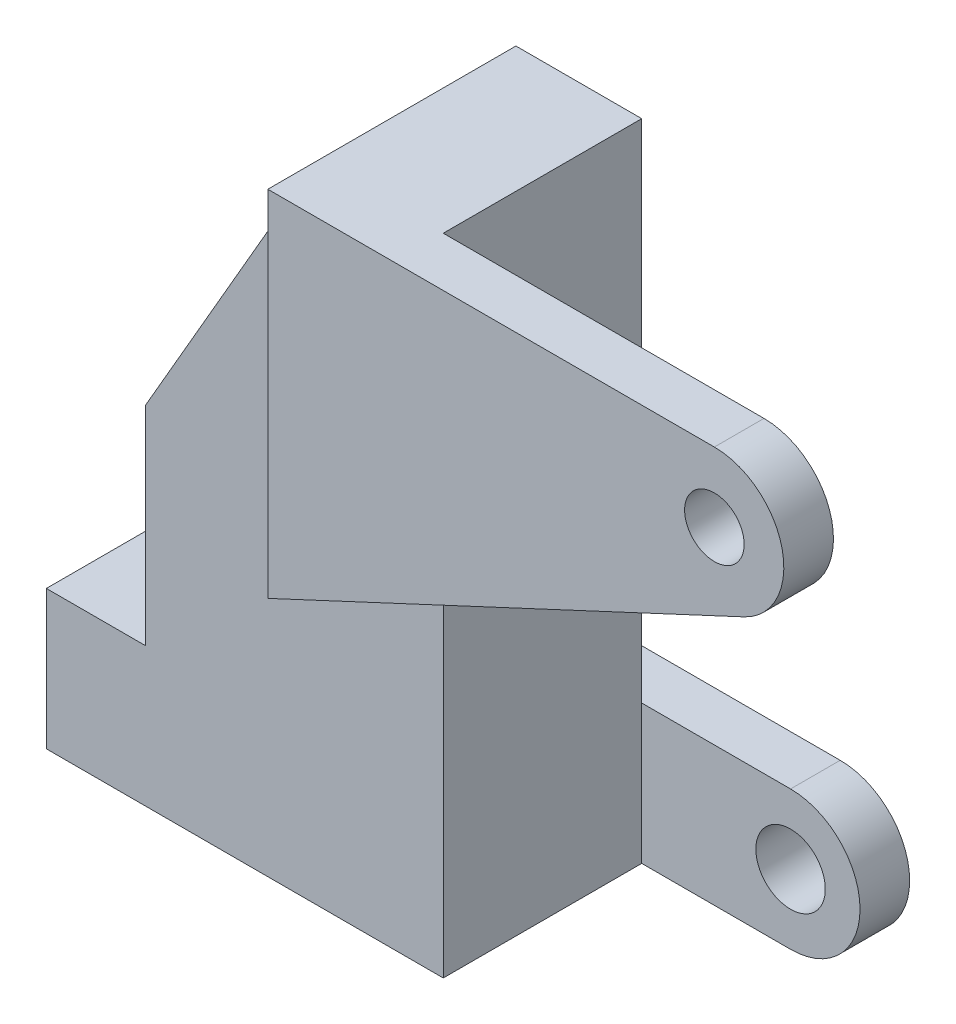
ISO-10303-21;
HEADER;
FILE_DESCRIPTION(('STEP AP214'),'2;1');
FILE_NAME('part.step','',(''),(''),'','','');
FILE_SCHEMA(('AUTOMOTIVE_DESIGN { 1 0 10303 214 1 1 1 1 }'));
ENDSEC;
DATA;
#1=APPLICATION_CONTEXT('core data for automotive mechanical design processes');
#2=APPLICATION_PROTOCOL_DEFINITION('international standard','automotive_design',2000,#1);
#3=PRODUCT_CONTEXT('',#1,'mechanical');
#4=PRODUCT('Part','Part','',(#3));
#5=PRODUCT_RELATED_PRODUCT_CATEGORY('part','',(#4));
#6=PRODUCT_DEFINITION_FORMATION('','',#4);
#7=PRODUCT_DEFINITION_CONTEXT('part definition',#1,'design');
#8=PRODUCT_DEFINITION('design','',#6,#7);
#9=PRODUCT_DEFINITION_SHAPE('','',#8);
#10=(LENGTH_UNIT() NAMED_UNIT(*) SI_UNIT(.MILLI.,.METRE.));
#11=(NAMED_UNIT(*) PLANE_ANGLE_UNIT() SI_UNIT($,.RADIAN.));
#12=(NAMED_UNIT(*) SI_UNIT($,.STERADIAN.) SOLID_ANGLE_UNIT());
#13=UNCERTAINTY_MEASURE_WITH_UNIT(LENGTH_MEASURE(1.E-05),#10,'distance_accuracy_value','');
#14=(GEOMETRIC_REPRESENTATION_CONTEXT(3) GLOBAL_UNCERTAINTY_ASSIGNED_CONTEXT((#13)) GLOBAL_UNIT_ASSIGNED_CONTEXT((#10,
#11,#12)) REPRESENTATION_CONTEXT('',''));
#15=CARTESIAN_POINT('',(0.,0.,0.));
#16=DIRECTION('',(0.,0.,1.));
#17=DIRECTION('',(1.,0.,0.));
#18=AXIS2_PLACEMENT_3D('',#15,#16,#17);
#19=CARTESIAN_POINT('',(0.,0.,0.));
#20=DIRECTION('',(0.,0.,1.));
#21=DIRECTION('',(1.,0.,0.));
#22=AXIS2_PLACEMENT_3D('',#19,#20,#21);
#23=PLANE('',#22);
#24=DIRECTION('',(0.,1.,0.));
#25=VECTOR('',#24,1.);
#26=CARTESIAN_POINT('',(10.,14.,0.));
#27=LINE('',#26,#25);
#28=CARTESIAN_POINT('',(10.,0.,0.));
#29=VERTEX_POINT('',#28);
#30=CARTESIAN_POINT('',(10.,14.,0.));
#31=VERTEX_POINT('',#30);
#32=EDGE_CURVE('E61',#29,#31,#27,.T.);
#33=ORIENTED_EDGE('',*,*,#32,.F.);
#34=DIRECTION('',(1.,0.,0.));
#35=VECTOR('',#34,1.);
#36=CARTESIAN_POINT('',(0.,0.,0.));
#37=LINE('',#36,#35);
#38=CARTESIAN_POINT('',(0.,0.,0.));
#39=VERTEX_POINT('',#38);
#40=EDGE_CURVE('E266',#39,#29,#37,.T.);
#41=ORIENTED_EDGE('',*,*,#40,.F.);
#42=DIRECTION('',(0.,-1.,0.));
#43=VECTOR('',#42,1.);
#44=CARTESIAN_POINT('',(0.,14.,0.));
#45=LINE('',#44,#43);
#46=CARTESIAN_POINT('',(0.,14.,0.));
#47=VERTEX_POINT('',#46);
#48=EDGE_CURVE('E241',#47,#39,#45,.T.);
#49=ORIENTED_EDGE('',*,*,#48,.F.);
#50=DIRECTION('',(-1.,0.,0.));
#51=VECTOR('',#50,1.);
#52=CARTESIAN_POINT('',(10.,14.,0.));
#53=LINE('',#52,#51);
#54=EDGE_CURVE('E247',#31,#47,#53,.T.);
#55=ORIENTED_EDGE('',*,*,#54,.F.);
#56=EDGE_LOOP('',(#33,#41,#49,#55));
#57=FACE_BOUND('',#56,.T.);
#58=ADVANCED_FACE('F45',(#57),#23,.F.);
#59=DIRECTION('',(1.,0.,0.));
#60=VECTOR('',#59,1.);
#61=CARTESIAN_POINT('',(10.,14.,0.));
#62=LINE('',#61,#60);
#63=CARTESIAN_POINT('',(40.,14.,0.));
#64=VERTEX_POINT('',#63);
#65=EDGE_CURVE('E324',#31,#64,#62,.T.);
#66=ORIENTED_EDGE('',*,*,#65,.F.);
#67=DIRECTION('',(0.,-1.,0.));
#68=VECTOR('',#67,1.);
#69=CARTESIAN_POINT('',(10.,35.,0.));
#70=LINE('',#69,#68);
#71=CARTESIAN_POINT('',(10.,35.,0.));
#72=VERTEX_POINT('',#71);
#73=EDGE_CURVE('E279',#72,#31,#70,.T.);
#74=ORIENTED_EDGE('',*,*,#73,.F.);
#75=DIRECTION('',(-0.500000000000001,-0.866025403784438,0.));
#76=VECTOR('',#75,1.);
#77=CARTESIAN_POINT('',(27.3205080756888,65.,0.));
#78=LINE('',#77,#76);
#79=CARTESIAN_POINT('',(27.3205080756888,65.,0.));
#80=VERTEX_POINT('',#79);
#81=EDGE_CURVE('E276',#80,#72,#78,.T.);
#82=ORIENTED_EDGE('',*,*,#81,.F.);
#83=DIRECTION('',(-1.,0.,0.));
#84=VECTOR('',#83,1.);
#85=CARTESIAN_POINT('',(40.,65.,0.));
#86=LINE('',#85,#84);
#87=CARTESIAN_POINT('',(40.,65.,0.));
#88=VERTEX_POINT('',#87);
#89=EDGE_CURVE('E273',#88,#80,#86,.T.);
#90=ORIENTED_EDGE('',*,*,#89,.F.);
#91=DIRECTION('',(0.,1.,0.));
#92=VECTOR('',#91,1.);
#93=CARTESIAN_POINT('',(40.,0.,0.));
#94=LINE('',#93,#92);
#95=EDGE_CURVE('E269',#64,#88,#94,.T.);
#96=ORIENTED_EDGE('',*,*,#95,.F.);
#97=EDGE_LOOP('',(#66,#74,#82,#90,#96));
#98=FACE_BOUND('',#97,.T.);
#99=ADVANCED_FACE('F358',(#98),#23,.F.);
#100=CARTESIAN_POINT('',(0.,14.,20.));
#101=DIRECTION('',(1.,0.,0.));
#102=DIRECTION('',(0.,0.,-1.));
#103=AXIS2_PLACEMENT_3D('',#100,#101,#102);
#104=PLANE('',#103);
#105=ORIENTED_EDGE('',*,*,#48,.T.);
#106=DIRECTION('',(0.,0.,-1.));
#107=VECTOR('',#106,1.);
#108=CARTESIAN_POINT('',(0.,0.,20.));
#109=LINE('',#108,#107);
#110=CARTESIAN_POINT('',(0.,0.,20.));
#111=VERTEX_POINT('',#110);
#112=EDGE_CURVE('E11',#111,#39,#109,.T.);
#113=ORIENTED_EDGE('',*,*,#112,.F.);
#114=DIRECTION('',(0.,-1.,0.));
#115=VECTOR('',#114,1.);
#116=CARTESIAN_POINT('',(0.,14.,20.));
#117=LINE('',#116,#115);
#118=CARTESIAN_POINT('',(0.,14.,20.));
#119=VERTEX_POINT('',#118);
#120=EDGE_CURVE('E242',#119,#111,#117,.T.);
#121=ORIENTED_EDGE('',*,*,#120,.F.);
#122=DIRECTION('',(0.,0.,-1.));
#123=VECTOR('',#122,1.);
#124=CARTESIAN_POINT('',(0.,14.,20.));
#125=LINE('',#124,#123);
#126=EDGE_CURVE('E262',#119,#47,#125,.T.);
#127=ORIENTED_EDGE('',*,*,#126,.T.);
#128=EDGE_LOOP('',(#105,#113,#121,#127));
#129=FACE_BOUND('',#128,.T.);
#130=ADVANCED_FACE('F47',(#129),#104,.F.);
#131=CARTESIAN_POINT('',(0.,0.,20.));
#132=DIRECTION('',(0.,1.,0.));
#133=DIRECTION('',(0.,0.,1.));
#134=AXIS2_PLACEMENT_3D('',#131,#132,#133);
#135=PLANE('',#134);
#136=ORIENTED_EDGE('',*,*,#40,.T.);
#137=DIRECTION('',(0.,0.,1.));
#138=VECTOR('',#137,1.);
#139=CARTESIAN_POINT('',(10.,0.,-5.));
#140=LINE('',#139,#138);
#141=CARTESIAN_POINT('',(10.,0.,-5.));
#142=VERTEX_POINT('',#141);
#143=EDGE_CURVE('E328',#142,#29,#140,.T.);
#144=ORIENTED_EDGE('',*,*,#143,.F.);
#145=DIRECTION('',(-1.,0.,0.));
#146=VECTOR('',#145,1.);
#147=CARTESIAN_POINT('',(10.,0.,-5.));
#148=LINE('',#147,#146);
#149=CARTESIAN_POINT('',(55.,0.,-5.));
#150=VERTEX_POINT('',#149);
#151=EDGE_CURVE('E173',#150,#142,#148,.T.);
#152=ORIENTED_EDGE('',*,*,#151,.F.);
#153=DIRECTION('',(0.,0.,1.));
#154=VECTOR('',#153,1.);
#155=CARTESIAN_POINT('',(55.,0.,-5.));
#156=LINE('',#155,#154);
#157=CARTESIAN_POINT('',(55.,0.,0.));
#158=VERTEX_POINT('',#157);
#159=EDGE_CURVE('E189',#150,#158,#156,.T.);
#160=ORIENTED_EDGE('',*,*,#159,.T.);
#161=DIRECTION('',(-1.,0.,0.));
#162=VECTOR('',#161,1.);
#163=CARTESIAN_POINT('',(10.,0.,0.));
#164=LINE('',#163,#162);
#165=CARTESIAN_POINT('',(40.,0.,0.));
#166=VERTEX_POINT('',#165);
#167=EDGE_CURVE('E178',#158,#166,#164,.T.);
#168=ORIENTED_EDGE('',*,*,#167,.T.);
#169=DIRECTION('',(0.,0.,-1.));
#170=VECTOR('',#169,1.);
#171=CARTESIAN_POINT('',(40.,0.,20.));
#172=LINE('',#171,#170);
#173=CARTESIAN_POINT('',(40.,0.,20.));
#174=VERTEX_POINT('',#173);
#175=EDGE_CURVE('E54',#174,#166,#172,.T.);
#176=ORIENTED_EDGE('',*,*,#175,.F.);
#177=DIRECTION('',(1.,0.,0.));
#178=VECTOR('',#177,1.);
#179=CARTESIAN_POINT('',(0.,0.,20.));
#180=LINE('',#179,#178);
#181=EDGE_CURVE('E246',#111,#174,#180,.T.);
#182=ORIENTED_EDGE('',*,*,#181,.F.);
#183=ORIENTED_EDGE('',*,*,#112,.T.);
#184=EDGE_LOOP('',(#136,#144,#152,#160,#168,#176,#182,#183));
#185=FACE_BOUND('',#184,.T.);
#186=ADVANCED_FACE('F318',(#185),#135,.F.);
#187=CARTESIAN_POINT('',(40.,0.,20.));
#188=DIRECTION('',(-1.,0.,0.));
#189=DIRECTION('',(0.,0.,1.));
#190=AXIS2_PLACEMENT_3D('',#187,#188,#189);
#191=PLANE('',#190);
#192=EDGE_CURVE('E270',#166,#64,#94,.T.);
#193=ORIENTED_EDGE('',*,*,#192,.T.);
#194=ORIENTED_EDGE('',*,*,#95,.T.);
#195=DIRECTION('',(0.,0.,-1.));
#196=VECTOR('',#195,1.);
#197=CARTESIAN_POINT('',(40.,65.,20.));
#198=LINE('',#197,#196);
#199=CARTESIAN_POINT('',(40.,65.,20.));
#200=VERTEX_POINT('',#199);
#201=EDGE_CURVE('E300',#200,#88,#198,.T.);
#202=ORIENTED_EDGE('',*,*,#201,.F.);
#203=DIRECTION('',(0.,1.,0.));
#204=VECTOR('',#203,1.);
#205=CARTESIAN_POINT('',(40.,0.,20.));
#206=LINE('',#205,#204);
#207=CARTESIAN_POINT('',(40.,35.2050541361082,20.));
#208=VERTEX_POINT('',#207);
#209=EDGE_CURVE('E69',#208,#200,#206,.T.);
#210=ORIENTED_EDGE('',*,*,#209,.F.);
#211=EDGE_CURVE('E250',#174,#208,#206,.T.);
#212=ORIENTED_EDGE('',*,*,#211,.F.);
#213=ORIENTED_EDGE('',*,*,#175,.T.);
#214=EDGE_LOOP('',(#193,#194,#202,#210,#212,#213));
#215=FACE_BOUND('',#214,.T.);
#216=ADVANCED_FACE('F306',(#215),#191,.F.);
#217=CARTESIAN_POINT('',(40.,65.,20.));
#218=DIRECTION('',(0.,-1.,0.));
#219=DIRECTION('',(0.,0.,-1.));
#220=AXIS2_PLACEMENT_3D('',#217,#218,#219);
#221=PLANE('',#220);
#222=ORIENTED_EDGE('',*,*,#89,.T.);
#223=DIRECTION('',(0.,0.,-1.));
#224=VECTOR('',#223,1.);
#225=CARTESIAN_POINT('',(27.3205080756888,65.,20.));
#226=LINE('',#225,#224);
#227=CARTESIAN_POINT('',(27.3205080756888,65.,20.));
#228=VERTEX_POINT('',#227);
#229=EDGE_CURVE('E296',#228,#80,#226,.T.);
#230=ORIENTED_EDGE('',*,*,#229,.F.);
#231=DIRECTION('',(0.,0.,-1.));
#232=VECTOR('',#231,1.);
#233=CARTESIAN_POINT('',(27.3205080756888,65.,25.));
#234=LINE('',#233,#232);
#235=CARTESIAN_POINT('',(27.3205080756888,65.,25.));
#236=VERTEX_POINT('',#235);
#237=EDGE_CURVE('E237',#236,#228,#234,.T.);
#238=ORIENTED_EDGE('',*,*,#237,.F.);
#239=DIRECTION('',(-1.,0.,0.));
#240=VECTOR('',#239,1.);
#241=CARTESIAN_POINT('',(72.3205080756888,65.,25.));
#242=LINE('',#241,#240);
#243=CARTESIAN_POINT('',(72.3205080756888,65.,25.));
#244=VERTEX_POINT('',#243);
#245=EDGE_CURVE('E197',#244,#236,#242,.T.);
#246=ORIENTED_EDGE('',*,*,#245,.F.);
#247=DIRECTION('',(0.,0.,-1.));
#248=VECTOR('',#247,1.);
#249=CARTESIAN_POINT('',(72.3205080756888,65.,25.));
#250=LINE('',#249,#248);
#251=CARTESIAN_POINT('',(72.3205080756888,65.,20.));
#252=VERTEX_POINT('',#251);
#253=EDGE_CURVE('E211',#244,#252,#250,.T.);
#254=ORIENTED_EDGE('',*,*,#253,.T.);
#255=DIRECTION('',(-1.,0.,0.));
#256=VECTOR('',#255,1.);
#257=CARTESIAN_POINT('',(72.3205080756888,65.,20.));
#258=LINE('',#257,#256);
#259=EDGE_CURVE('E195',#252,#200,#258,.T.);
#260=ORIENTED_EDGE('',*,*,#259,.T.);
#261=ORIENTED_EDGE('',*,*,#201,.T.);
#262=EDGE_LOOP('',(#222,#230,#238,#246,#254,#260,#261));
#263=FACE_BOUND('',#262,.T.);
#264=ADVANCED_FACE('F376',(#263),#221,.F.);
#265=CARTESIAN_POINT('',(27.3205080756888,65.,20.));
#266=DIRECTION('',(0.866025403784438,-0.500000000000001,0.));
#267=DIRECTION('',(0.500000000000001,0.866025403784438,0.));
#268=AXIS2_PLACEMENT_3D('',#265,#266,#267);
#269=PLANE('',#268);
#270=ORIENTED_EDGE('',*,*,#81,.T.);
#271=DIRECTION('',(0.,0.,-1.));
#272=VECTOR('',#271,1.);
#273=CARTESIAN_POINT('',(10.,35.,20.));
#274=LINE('',#273,#272);
#275=CARTESIAN_POINT('',(10.,35.,20.));
#276=VERTEX_POINT('',#275);
#277=EDGE_CURVE('E292',#276,#72,#274,.T.);
#278=ORIENTED_EDGE('',*,*,#277,.F.);
#279=DIRECTION('',(-0.500000000000001,-0.866025403784438,0.));
#280=VECTOR('',#279,1.);
#281=CARTESIAN_POINT('',(27.3205080756888,65.,20.));
#282=LINE('',#281,#280);
#283=EDGE_CURVE('E253',#228,#276,#282,.T.);
#284=ORIENTED_EDGE('',*,*,#283,.F.);
#285=ORIENTED_EDGE('',*,*,#229,.T.);
#286=EDGE_LOOP('',(#270,#278,#284,#285));
#287=FACE_BOUND('',#286,.T.);
#288=ADVANCED_FACE('F390',(#287),#269,.F.);
#289=CARTESIAN_POINT('',(10.,35.,20.));
#290=DIRECTION('',(1.,0.,0.));
#291=DIRECTION('',(0.,1.,0.));
#292=AXIS2_PLACEMENT_3D('',#289,#290,#291);
#293=PLANE('',#292);
#294=ORIENTED_EDGE('',*,*,#73,.T.);
#295=DIRECTION('',(0.,0.,-1.));
#296=VECTOR('',#295,1.);
#297=CARTESIAN_POINT('',(10.,14.,20.));
#298=LINE('',#297,#296);
#299=CARTESIAN_POINT('',(10.,14.,20.));
#300=VERTEX_POINT('',#299);
#301=EDGE_CURVE('E288',#300,#31,#298,.T.);
#302=ORIENTED_EDGE('',*,*,#301,.F.);
#303=DIRECTION('',(0.,-1.,0.));
#304=VECTOR('',#303,1.);
#305=CARTESIAN_POINT('',(10.,35.,20.));
#306=LINE('',#305,#304);
#307=EDGE_CURVE('E256',#276,#300,#306,.T.);
#308=ORIENTED_EDGE('',*,*,#307,.F.);
#309=ORIENTED_EDGE('',*,*,#277,.T.);
#310=EDGE_LOOP('',(#294,#302,#308,#309));
#311=FACE_BOUND('',#310,.T.);
#312=ADVANCED_FACE('F353',(#311),#293,.F.);
#313=CARTESIAN_POINT('',(10.,14.,20.));
#314=DIRECTION('',(0.,-1.,0.));
#315=DIRECTION('',(1.,0.,0.));
#316=AXIS2_PLACEMENT_3D('',#313,#314,#315);
#317=PLANE('',#316);
#318=ORIENTED_EDGE('',*,*,#54,.T.);
#319=ORIENTED_EDGE('',*,*,#126,.F.);
#320=DIRECTION('',(-1.,0.,0.));
#321=VECTOR('',#320,1.);
#322=CARTESIAN_POINT('',(10.,14.,20.));
#323=LINE('',#322,#321);
#324=EDGE_CURVE('E259',#300,#119,#323,.T.);
#325=ORIENTED_EDGE('',*,*,#324,.F.);
#326=ORIENTED_EDGE('',*,*,#301,.T.);
#327=EDGE_LOOP('',(#318,#319,#325,#326));
#328=FACE_BOUND('',#327,.T.);
#329=ADVANCED_FACE('F349',(#328),#317,.F.);
#330=CARTESIAN_POINT('',(0.,0.,20.));
#331=DIRECTION('',(0.,0.,1.));
#332=DIRECTION('',(1.,0.,0.));
#333=AXIS2_PLACEMENT_3D('',#330,#331,#332);
#334=PLANE('',#333);
#335=DIRECTION('',(0.906307787036648,0.422618261740704,0.));
#336=VECTOR('',#335,1.);
#337=CARTESIAN_POINT('',(27.3205080756888,29.2925099502873,20.));
#338=LINE('',#337,#336);
#339=CARTESIAN_POINT('',(27.3205080756888,29.2925099502873,20.));
#340=VERTEX_POINT('',#339);
#341=EDGE_CURVE('E220',#340,#208,#338,.T.);
#342=ORIENTED_EDGE('',*,*,#341,.F.);
#343=DIRECTION('',(0.,-1.,0.));
#344=VECTOR('',#343,1.);
#345=CARTESIAN_POINT('',(27.3205080756888,65.,20.));
#346=LINE('',#345,#344);
#347=EDGE_CURVE('E215',#228,#340,#346,.T.);
#348=ORIENTED_EDGE('',*,*,#347,.F.);
#349=ORIENTED_EDGE('',*,*,#283,.T.);
#350=ORIENTED_EDGE('',*,*,#307,.T.);
#351=ORIENTED_EDGE('',*,*,#324,.T.);
#352=ORIENTED_EDGE('',*,*,#120,.T.);
#353=ORIENTED_EDGE('',*,*,#181,.T.);
#354=ORIENTED_EDGE('',*,*,#211,.T.);
#355=EDGE_LOOP('',(#342,#348,#349,#350,#351,#352,#353,#354));
#356=FACE_BOUND('',#355,.T.);
#357=ADVANCED_FACE('F387',(#356),#334,.T.);
#358=CARTESIAN_POINT('',(72.3205080756888,58.,20.));
#359=DIRECTION('',(0.,0.,1.));
#360=DIRECTION('',(1.,0.,0.));
#361=AXIS2_PLACEMENT_3D('',#358,#359,#360);
#362=PLANE('',#361);
#363=CARTESIAN_POINT('',(72.3205080756888,58.,20.));
#364=DIRECTION('',(0.,0.,1.));
#365=DIRECTION('',(1.,0.,0.));
#366=AXIS2_PLACEMENT_3D('',#363,#364,#365);
#367=CIRCLE('',#366,3.00000000000001);
#368=CARTESIAN_POINT('',(75.3205080756888,58.,20.));
#369=VERTEX_POINT('',#368);
#370=EDGE_CURVE('E182',#369,#369,#367,.T.);
#371=ORIENTED_EDGE('',*,*,#370,.T.);
#372=EDGE_LOOP('',(#371));
#373=FACE_BOUND('',#372,.T.);
#374=CARTESIAN_POINT('',(75.2788359078737,51.6558454907435,20.));
#375=VERTEX_POINT('',#374);
#376=EDGE_CURVE('E219',#208,#375,#338,.T.);
#377=ORIENTED_EDGE('',*,*,#376,.F.);
#378=ORIENTED_EDGE('',*,*,#209,.T.);
#379=ORIENTED_EDGE('',*,*,#259,.F.);
#380=CARTESIAN_POINT('',(72.3205080756888,58.,20.));
#381=DIRECTION('',(0.,0.,1.));
#382=DIRECTION('',(1.,0.,0.));
#383=AXIS2_PLACEMENT_3D('',#380,#381,#382);
#384=CIRCLE('',#383,6.99999999999999);
#385=EDGE_CURVE('E202',#375,#252,#384,.T.);
#386=ORIENTED_EDGE('',*,*,#385,.F.);
#387=EDGE_LOOP('',(#377,#378,#379,#386));
#388=FACE_BOUND('',#387,.T.);
#389=ADVANCED_FACE('F374',(#373,#388),#362,.F.);
#390=CARTESIAN_POINT('',(72.3205080756888,58.,25.));
#391=DIRECTION('',(0.,0.,1.));
#392=DIRECTION('',(1.,0.,0.));
#393=AXIS2_PLACEMENT_3D('',#390,#391,#392);
#394=PLANE('',#393);
#395=ORIENTED_EDGE('',*,*,#245,.T.);
#396=DIRECTION('',(0.,-1.,0.));
#397=VECTOR('',#396,1.);
#398=CARTESIAN_POINT('',(27.3205080756888,65.,25.));
#399=LINE('',#398,#397);
#400=CARTESIAN_POINT('',(27.3205080756888,29.2925099502873,25.));
#401=VERTEX_POINT('',#400);
#402=EDGE_CURVE('E201',#236,#401,#399,.T.);
#403=ORIENTED_EDGE('',*,*,#402,.T.);
#404=DIRECTION('',(0.906307787036648,0.422618261740704,0.));
#405=VECTOR('',#404,1.);
#406=CARTESIAN_POINT('',(27.3205080756888,29.2925099502873,25.));
#407=LINE('',#406,#405);
#408=CARTESIAN_POINT('',(75.2788359078737,51.6558454907435,25.));
#409=VERTEX_POINT('',#408);
#410=EDGE_CURVE('E205',#401,#409,#407,.T.);
#411=ORIENTED_EDGE('',*,*,#410,.T.);
#412=CARTESIAN_POINT('',(72.3205080756888,58.,25.));
#413=DIRECTION('',(0.,0.,1.));
#414=DIRECTION('',(1.,0.,0.));
#415=AXIS2_PLACEMENT_3D('',#412,#413,#414);
#416=CIRCLE('',#415,6.99999999999999);
#417=EDGE_CURVE('E208',#409,#244,#416,.T.);
#418=ORIENTED_EDGE('',*,*,#417,.T.);
#419=EDGE_LOOP('',(#395,#403,#411,#418));
#420=FACE_BOUND('',#419,.T.);
#421=CARTESIAN_POINT('',(72.3205080756888,58.,25.));
#422=DIRECTION('',(0.,0.,1.));
#423=DIRECTION('',(1.,0.,0.));
#424=AXIS2_PLACEMENT_3D('',#421,#422,#423);
#425=CIRCLE('',#424,3.00000000000001);
#426=CARTESIAN_POINT('',(75.3205080756888,58.,25.));
#427=VERTEX_POINT('',#426);
#428=EDGE_CURVE('E187',#427,#427,#425,.T.);
#429=ORIENTED_EDGE('',*,*,#428,.F.);
#430=EDGE_LOOP('',(#429));
#431=FACE_BOUND('',#430,.T.);
#432=ADVANCED_FACE('F381',(#420,#431),#394,.T.);
#433=CARTESIAN_POINT('',(27.3205080756888,65.,25.));
#434=DIRECTION('',(1.,0.,0.));
#435=DIRECTION('',(0.,1.,0.));
#436=AXIS2_PLACEMENT_3D('',#433,#434,#435);
#437=PLANE('',#436);
#438=ORIENTED_EDGE('',*,*,#347,.T.);
#439=DIRECTION('',(0.,0.,-1.));
#440=VECTOR('',#439,1.);
#441=CARTESIAN_POINT('',(27.3205080756888,29.2925099502873,25.));
#442=LINE('',#441,#440);
#443=EDGE_CURVE('E233',#401,#340,#442,.T.);
#444=ORIENTED_EDGE('',*,*,#443,.F.);
#445=ORIENTED_EDGE('',*,*,#402,.F.);
#446=ORIENTED_EDGE('',*,*,#237,.T.);
#447=EDGE_LOOP('',(#438,#444,#445,#446));
#448=FACE_BOUND('',#447,.T.);
#449=ADVANCED_FACE('F385',(#448),#437,.F.);
#450=CARTESIAN_POINT('',(27.3205080756888,29.2925099502873,25.));
#451=DIRECTION('',(-0.422618261740704,0.906307787036648,0.));
#452=DIRECTION('',(-0.906307787036648,-0.422618261740704,0.));
#453=AXIS2_PLACEMENT_3D('',#450,#451,#452);
#454=PLANE('',#453);
#455=ORIENTED_EDGE('',*,*,#341,.T.);
#456=ORIENTED_EDGE('',*,*,#376,.T.);
#457=DIRECTION('',(0.,0.,-1.));
#458=VECTOR('',#457,1.);
#459=CARTESIAN_POINT('',(75.2788359078737,51.6558454907435,25.));
#460=LINE('',#459,#458);
#461=EDGE_CURVE('E229',#409,#375,#460,.T.);
#462=ORIENTED_EDGE('',*,*,#461,.F.);
#463=ORIENTED_EDGE('',*,*,#410,.F.);
#464=ORIENTED_EDGE('',*,*,#443,.T.);
#465=EDGE_LOOP('',(#455,#456,#462,#463,#464));
#466=FACE_BOUND('',#465,.T.);
#467=ADVANCED_FACE('F365',(#466),#454,.F.);
#468=CARTESIAN_POINT('',(72.3205080756888,58.,25.));
#469=DIRECTION('',(0.,0.,-1.));
#470=DIRECTION('',(-1.,0.,0.));
#471=AXIS2_PLACEMENT_3D('',#468,#469,#470);
#472=CYLINDRICAL_SURFACE('',#471,6.99999999999999);
#473=ORIENTED_EDGE('',*,*,#385,.T.);
#474=ORIENTED_EDGE('',*,*,#253,.F.);
#475=ORIENTED_EDGE('',*,*,#417,.F.);
#476=ORIENTED_EDGE('',*,*,#461,.T.);
#477=EDGE_LOOP('',(#473,#474,#475,#476));
#478=FACE_BOUND('',#477,.T.);
#479=ADVANCED_FACE('F371',(#478),#472,.T.);
#480=CARTESIAN_POINT('',(72.3205080756888,58.,25.));
#481=DIRECTION('',(0.,0.,-1.));
#482=DIRECTION('',(-1.,0.,0.));
#483=AXIS2_PLACEMENT_3D('',#480,#481,#482);
#484=CYLINDRICAL_SURFACE('',#483,3.00000000000001);
#485=ORIENTED_EDGE('',*,*,#428,.T.);
#486=EDGE_LOOP('',(#485));
#487=FACE_BOUND('',#486,.T.);
#488=ORIENTED_EDGE('',*,*,#370,.F.);
#489=EDGE_LOOP('',(#488));
#490=FACE_BOUND('',#489,.T.);
#491=ADVANCED_FACE('F426',(#487,#490),#484,.F.);
#492=CARTESIAN_POINT('',(55.,6.99999999999999,-5.));
#493=DIRECTION('',(0.,0.,-1.));
#494=DIRECTION('',(-1.,0.,0.));
#495=AXIS2_PLACEMENT_3D('',#492,#493,#494);
#496=PLANE('',#495);
#497=DIRECTION('',(0.,1.,0.));
#498=VECTOR('',#497,1.);
#499=CARTESIAN_POINT('',(10.,14.,-5.));
#500=LINE('',#499,#498);
#501=CARTESIAN_POINT('',(10.,14.,-5.));
#502=VERTEX_POINT('',#501);
#503=EDGE_CURVE('E167',#142,#502,#500,.T.);
#504=ORIENTED_EDGE('',*,*,#503,.T.);
#505=DIRECTION('',(1.,0.,0.));
#506=VECTOR('',#505,1.);
#507=CARTESIAN_POINT('',(10.,14.,-5.));
#508=LINE('',#507,#506);
#509=CARTESIAN_POINT('',(55.,14.,-5.));
#510=VERTEX_POINT('',#509);
#511=EDGE_CURVE('E155',#502,#510,#508,.T.);
#512=ORIENTED_EDGE('',*,*,#511,.T.);
#513=CARTESIAN_POINT('',(55.,6.99999999999999,-5.));
#514=DIRECTION('',(0.,0.,-1.));
#515=DIRECTION('',(-1.,0.,0.));
#516=AXIS2_PLACEMENT_3D('',#513,#514,#515);
#517=CIRCLE('',#516,6.99999999999999);
#518=EDGE_CURVE('E166',#510,#150,#517,.T.);
#519=ORIENTED_EDGE('',*,*,#518,.T.);
#520=ORIENTED_EDGE('',*,*,#151,.T.);
#521=EDGE_LOOP('',(#504,#512,#519,#520));
#522=FACE_BOUND('',#521,.T.);
#523=CARTESIAN_POINT('',(55.,6.99999999999999,-5.));
#524=DIRECTION('',(0.,0.,-1.));
#525=DIRECTION('',(-1.,0.,0.));
#526=AXIS2_PLACEMENT_3D('',#523,#524,#525);
#527=CIRCLE('',#526,3.5);
#528=CARTESIAN_POINT('',(51.5,6.99999999999999,-5.));
#529=VERTEX_POINT('',#528);
#530=EDGE_CURVE('E337',#529,#529,#527,.T.);
#531=ORIENTED_EDGE('',*,*,#530,.F.);
#532=EDGE_LOOP('',(#531));
#533=FACE_BOUND('',#532,.T.);
#534=ADVANCED_FACE('F170',(#522,#533),#496,.T.);
#535=CARTESIAN_POINT('',(55.,6.99999999999999,0.));
#536=DIRECTION('',(0.,0.,-1.));
#537=DIRECTION('',(-1.,0.,0.));
#538=AXIS2_PLACEMENT_3D('',#535,#536,#537);
#539=PLANE('',#538);
#540=ORIENTED_EDGE('',*,*,#192,.F.);
#541=ORIENTED_EDGE('',*,*,#167,.F.);
#542=CARTESIAN_POINT('',(55.,6.99999999999999,0.));
#543=DIRECTION('',(0.,0.,-1.));
#544=DIRECTION('',(-1.,0.,0.));
#545=AXIS2_PLACEMENT_3D('',#542,#543,#544);
#546=CIRCLE('',#545,6.99999999999999);
#547=CARTESIAN_POINT('',(55.,14.,0.));
#548=VERTEX_POINT('',#547);
#549=EDGE_CURVE('E321',#548,#158,#546,.T.);
#550=ORIENTED_EDGE('',*,*,#549,.F.);
#551=EDGE_CURVE('E316',#64,#548,#62,.T.);
#552=ORIENTED_EDGE('',*,*,#551,.F.);
#553=EDGE_LOOP('',(#540,#541,#550,#552));
#554=FACE_BOUND('',#553,.T.);
#555=CARTESIAN_POINT('',(55.,6.99999999999999,0.));
#556=DIRECTION('',(0.,0.,-1.));
#557=DIRECTION('',(-1.,0.,0.));
#558=AXIS2_PLACEMENT_3D('',#555,#556,#557);
#559=CIRCLE('',#558,3.5);
#560=CARTESIAN_POINT('',(51.5,6.99999999999999,0.));
#561=VERTEX_POINT('',#560);
#562=EDGE_CURVE('E528',#561,#561,#559,.T.);
#563=ORIENTED_EDGE('',*,*,#562,.T.);
#564=EDGE_LOOP('',(#563));
#565=FACE_BOUND('',#564,.T.);
#566=ADVANCED_FACE('F313',(#554,#565),#539,.F.);
#567=CARTESIAN_POINT('',(10.,14.,-5.));
#568=DIRECTION('',(1.,0.,0.));
#569=DIRECTION('',(0.,0.,-1.));
#570=AXIS2_PLACEMENT_3D('',#567,#568,#569);
#571=PLANE('',#570);
#572=ORIENTED_EDGE('',*,*,#32,.T.);
#573=DIRECTION('',(0.,0.,1.));
#574=VECTOR('',#573,1.);
#575=CARTESIAN_POINT('',(10.,14.,-5.));
#576=LINE('',#575,#574);
#577=EDGE_CURVE('E160',#502,#31,#576,.T.);
#578=ORIENTED_EDGE('',*,*,#577,.F.);
#579=ORIENTED_EDGE('',*,*,#503,.F.);
#580=ORIENTED_EDGE('',*,*,#143,.T.);
#581=EDGE_LOOP('',(#572,#578,#579,#580));
#582=FACE_BOUND('',#581,.T.);
#583=ADVANCED_FACE('F180',(#582),#571,.F.);
#584=CARTESIAN_POINT('',(10.,14.,-5.));
#585=DIRECTION('',(0.,-1.,0.));
#586=DIRECTION('',(1.,0.,0.));
#587=AXIS2_PLACEMENT_3D('',#584,#585,#586);
#588=PLANE('',#587);
#589=ORIENTED_EDGE('',*,*,#65,.T.);
#590=ORIENTED_EDGE('',*,*,#551,.T.);
#591=DIRECTION('',(0.,0.,1.));
#592=VECTOR('',#591,1.);
#593=CARTESIAN_POINT('',(55.,14.,-5.));
#594=LINE('',#593,#592);
#595=EDGE_CURVE('E162',#510,#548,#594,.T.);
#596=ORIENTED_EDGE('',*,*,#595,.F.);
#597=ORIENTED_EDGE('',*,*,#511,.F.);
#598=ORIENTED_EDGE('',*,*,#577,.T.);
#599=EDGE_LOOP('',(#589,#590,#596,#597,#598));
#600=FACE_BOUND('',#599,.T.);
#601=ADVANCED_FACE('F158',(#600),#588,.F.);
#602=CARTESIAN_POINT('',(55.,6.99999999999999,-5.));
#603=DIRECTION('',(0.,0.,1.));
#604=DIRECTION('',(1.,0.,0.));
#605=AXIS2_PLACEMENT_3D('',#602,#603,#604);
#606=CYLINDRICAL_SURFACE('',#605,6.99999999999999);
#607=ORIENTED_EDGE('',*,*,#549,.T.);
#608=ORIENTED_EDGE('',*,*,#159,.F.);
#609=ORIENTED_EDGE('',*,*,#518,.F.);
#610=ORIENTED_EDGE('',*,*,#595,.T.);
#611=EDGE_LOOP('',(#607,#608,#609,#610));
#612=FACE_BOUND('',#611,.T.);
#613=ADVANCED_FACE('F341',(#612),#606,.T.);
#614=CARTESIAN_POINT('',(55.,6.99999999999999,-5.));
#615=DIRECTION('',(0.,0.,1.));
#616=DIRECTION('',(1.,0.,0.));
#617=AXIS2_PLACEMENT_3D('',#614,#615,#616);
#618=CYLINDRICAL_SURFACE('',#617,3.5);
#619=ORIENTED_EDGE('',*,*,#530,.T.);
#620=EDGE_LOOP('',(#619));
#621=FACE_BOUND('',#620,.T.);
#622=ORIENTED_EDGE('',*,*,#562,.F.);
#623=EDGE_LOOP('',(#622));
#624=FACE_BOUND('',#623,.T.);
#625=ADVANCED_FACE('F511',(#621,#624),#618,.F.);
#626=CLOSED_SHELL('',(#58,#99,#130,#186,#216,#264,#288,#312,#329,#357,#389,#432,#449,#467,#479,
#491,#534,#566,#583,#601,#613,#625));
#627=MANIFOLD_SOLID_BREP('B2',#626);
#628=ADVANCED_BREP_SHAPE_REPRESENTATION('',(#18,#627),#14);
#629=SHAPE_DEFINITION_REPRESENTATION(#9,#628);
ENDSEC;
END-ISO-10303-21;
